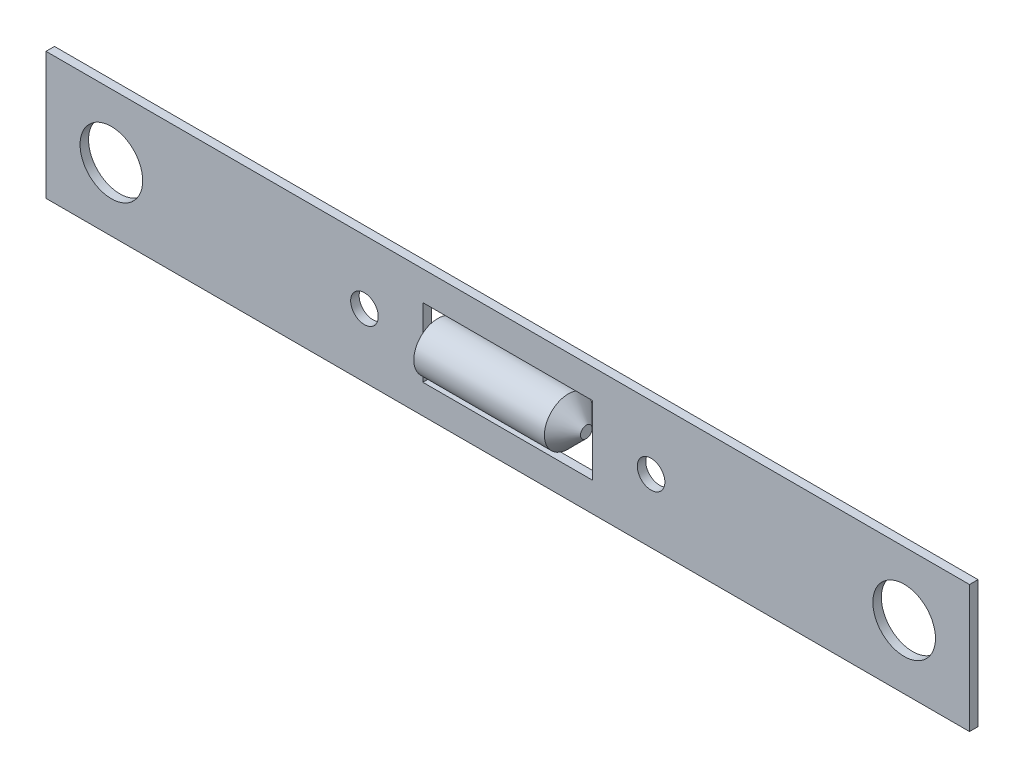
ISO-10303-21;
HEADER;
FILE_DESCRIPTION(('STEP AP214'),'2;1');
FILE_NAME('part.step','',(''),(''),'','','');
FILE_SCHEMA(('AUTOMOTIVE_DESIGN { 1 0 10303 214 1 1 1 1 }'));
ENDSEC;
DATA;
#1=APPLICATION_CONTEXT('core data for automotive mechanical design processes');
#2=APPLICATION_PROTOCOL_DEFINITION('international standard','automotive_design',2000,#1);
#3=PRODUCT_CONTEXT('',#1,'mechanical');
#4=PRODUCT('Part','Part','',(#3));
#5=PRODUCT_RELATED_PRODUCT_CATEGORY('part','',(#4));
#6=PRODUCT_DEFINITION_FORMATION('','',#4);
#7=PRODUCT_DEFINITION_CONTEXT('part definition',#1,'design');
#8=PRODUCT_DEFINITION('design','',#6,#7);
#9=PRODUCT_DEFINITION_SHAPE('','',#8);
#10=(LENGTH_UNIT() NAMED_UNIT(*) SI_UNIT(.MILLI.,.METRE.));
#11=(NAMED_UNIT(*) PLANE_ANGLE_UNIT() SI_UNIT($,.RADIAN.));
#12=(NAMED_UNIT(*) SI_UNIT($,.STERADIAN.) SOLID_ANGLE_UNIT());
#13=UNCERTAINTY_MEASURE_WITH_UNIT(LENGTH_MEASURE(1.E-05),#10,'distance_accuracy_value','');
#14=(GEOMETRIC_REPRESENTATION_CONTEXT(3) GLOBAL_UNCERTAINTY_ASSIGNED_CONTEXT((#13)) GLOBAL_UNIT_ASSIGNED_CONTEXT((#10,
#11,#12)) REPRESENTATION_CONTEXT('',''));
#15=CARTESIAN_POINT('',(0.,0.,0.));
#16=DIRECTION('',(0.,0.,1.));
#17=DIRECTION('',(1.,0.,0.));
#18=AXIS2_PLACEMENT_3D('',#15,#16,#17);
#19=CARTESIAN_POINT('',(7.,0.,0.));
#20=DIRECTION('',(1.,0.,0.));
#21=DIRECTION('',(0.,0.,-1.));
#22=AXIS2_PLACEMENT_3D('',#19,#20,#21);
#23=PLANE('',#22);
#24=CARTESIAN_POINT('',(7.00000000006185,0.,0.));
#25=DIRECTION('',(-1.,0.,0.));
#26=DIRECTION('',(0.,0.,1.));
#27=AXIS2_PLACEMENT_3D('',#24,#25,#26);
#28=CIRCLE('',#27,0.550000000032469);
#29=CARTESIAN_POINT('',(7.00000000006185,0.,0.550000000032469));
#30=VERTEX_POINT('',#29);
#31=EDGE_CURVE('P0_E18',#30,#30,#28,.T.);
#32=ORIENTED_EDGE('',*,*,#31,.F.);
#33=EDGE_LOOP('',(#32));
#34=FACE_BOUND('',#33,.T.);
#35=ADVANCED_FACE('P0_F15',(#34),#23,.T.);
#36=CARTESIAN_POINT('',(-7.,0.,0.));
#37=DIRECTION('',(1.,0.,0.));
#38=DIRECTION('',(0.,0.,-1.));
#39=AXIS2_PLACEMENT_3D('',#36,#37,#38);
#40=PLANE('',#39);
#41=CARTESIAN_POINT('',(-7.,0.,0.));
#42=DIRECTION('',(1.,0.,0.));
#43=DIRECTION('',(0.,0.,-1.));
#44=AXIS2_PLACEMENT_3D('',#41,#42,#43);
#45=CIRCLE('',#44,2.25);
#46=CARTESIAN_POINT('',(-7.,0.,-2.25));
#47=VERTEX_POINT('',#46);
#48=EDGE_CURVE('P0_E23',#47,#47,#45,.T.);
#49=ORIENTED_EDGE('',*,*,#48,.F.);
#50=EDGE_LOOP('',(#49));
#51=FACE_BOUND('',#50,.T.);
#52=ADVANCED_FACE('P0_F39',(#51),#40,.F.);
#53=CARTESIAN_POINT('',(5.30000000003383,0.,0.));
#54=DIRECTION('',(-1.,0.,0.));
#55=DIRECTION('',(0.,0.,1.));
#56=AXIS2_PLACEMENT_3D('',#53,#54,#55);
#57=CONICAL_SURFACE('',#56,2.25000000006048,0.785398163397448);
#58=CARTESIAN_POINT('',(5.3,0.,0.));
#59=DIRECTION('',(1.,0.,0.));
#60=DIRECTION('',(0.,0.,-1.));
#61=AXIS2_PLACEMENT_3D('',#58,#59,#60);
#62=CIRCLE('',#61,2.25);
#63=CARTESIAN_POINT('',(5.3,0.,2.25000000009432));
#64=VERTEX_POINT('',#63);
#65=EDGE_CURVE('P0_E10',#64,#64,#62,.F.);
#66=CARTESIAN_POINT('',(5.3,0.,2.25000000009432));
#67=CARTESIAN_POINT('',(5.31770833333398,0.,2.23229166676034));
#68=CARTESIAN_POINT('',(5.33541666666795,0.,2.21458333342636));
#69=CARTESIAN_POINT('',(5.37083333333591,0.,2.1791666667584));
#70=CARTESIAN_POINT('',(5.38854166666989,0.,2.16145833342443));
#71=CARTESIAN_POINT('',(5.42395833333784,0.,2.12604166675647));
#72=CARTESIAN_POINT('',(5.44166666667182,0.,2.10833333342249));
#73=CARTESIAN_POINT('',(5.47708333333978,0.,2.07291666675454));
#74=CARTESIAN_POINT('',(5.49479166667375,0.,2.05520833342056));
#75=CARTESIAN_POINT('',(5.53020833334171,0.,2.01979166675261));
#76=CARTESIAN_POINT('',(5.54791666667569,0.,2.00208333341863));
#77=CARTESIAN_POINT('',(5.58333333334364,0.,1.96666666675067));
#78=CARTESIAN_POINT('',(5.60104166667762,0.,1.9489583334167));
#79=CARTESIAN_POINT('',(5.63645833334557,0.,1.91354166674874));
#80=CARTESIAN_POINT('',(5.65416666667955,0.,1.89583333341476));
#81=CARTESIAN_POINT('',(5.68958333334751,0.,1.86041666674681));
#82=CARTESIAN_POINT('',(5.70729166668148,0.,1.84270833341283));
#83=CARTESIAN_POINT('',(5.74270833334944,0.,1.80729166674488));
#84=CARTESIAN_POINT('',(5.76041666668342,0.,1.7895833334109));
#85=CARTESIAN_POINT('',(5.79583333335137,0.,1.75416666674294));
#86=CARTESIAN_POINT('',(5.81354166668535,0.,1.73645833340897));
#87=CARTESIAN_POINT('',(5.8489583333533,0.,1.70104166674101));
#88=CARTESIAN_POINT('',(5.86666666668728,0.,1.68333333340703));
#89=CARTESIAN_POINT('',(5.90208333335524,0.,1.64791666673908));
#90=CARTESIAN_POINT('',(5.91979166668921,0.,1.6302083334051));
#91=CARTESIAN_POINT('',(5.95520833335717,0.,1.59479166673714));
#92=CARTESIAN_POINT('',(5.97291666669115,0.,1.57708333340317));
#93=CARTESIAN_POINT('',(6.0083333333591,0.,1.54166666673521));
#94=CARTESIAN_POINT('',(6.02604166669308,0.,1.52395833340123));
#95=CARTESIAN_POINT('',(6.06145833336103,0.,1.48854166673328));
#96=CARTESIAN_POINT('',(6.07916666669501,0.,1.4708333333993));
#97=CARTESIAN_POINT('',(6.11458333336297,0.,1.43541666673135));
#98=CARTESIAN_POINT('',(6.13229166669695,0.,1.41770833339737));
#99=CARTESIAN_POINT('',(6.1677083333649,0.,1.38229166672941));
#100=CARTESIAN_POINT('',(6.18541666669888,0.,1.36458333339544));
#101=CARTESIAN_POINT('',(6.22083333336683,0.,1.32916666672748));
#102=CARTESIAN_POINT('',(6.23854166670081,0.,1.3114583333935));
#103=CARTESIAN_POINT('',(6.27395833336876,0.,1.27604166672555));
#104=CARTESIAN_POINT('',(6.29166666670274,0.,1.25833333339157));
#105=CARTESIAN_POINT('',(6.3270833333707,0.,1.22291666672362));
#106=CARTESIAN_POINT('',(6.34479166670468,0.,1.20520833338964));
#107=CARTESIAN_POINT('',(6.38020833337263,0.,1.16979166672168));
#108=CARTESIAN_POINT('',(6.39791666670661,0.,1.15208333338771));
#109=CARTESIAN_POINT('',(6.43333333337456,0.,1.11666666671975));
#110=CARTESIAN_POINT('',(6.45104166670854,0.,1.09895833338577));
#111=CARTESIAN_POINT('',(6.4864583333765,0.,1.06354166671782));
#112=CARTESIAN_POINT('',(6.50416666671047,0.,1.04583333338384));
#113=CARTESIAN_POINT('',(6.53958333337843,0.,1.01041666671589));
#114=CARTESIAN_POINT('',(6.55729166671241,0.,0.992708333381907));
#115=CARTESIAN_POINT('',(6.59270833338036,0.,0.957291666713952));
#116=CARTESIAN_POINT('',(6.61041666671434,0.,0.939583333379975));
#117=CARTESIAN_POINT('',(6.64583333338229,0.,0.90416666671202));
#118=CARTESIAN_POINT('',(6.66354166671627,0.,0.886458333378042));
#119=CARTESIAN_POINT('',(6.69895833338423,0.,0.851041666710087));
#120=CARTESIAN_POINT('',(6.71666666671821,0.,0.83333333337611));
#121=CARTESIAN_POINT('',(6.75208333338616,0.,0.797916666708155));
#122=CARTESIAN_POINT('',(6.76979166672014,0.,0.780208333374177));
#123=CARTESIAN_POINT('',(6.80520833338809,0.,0.744791666706222));
#124=CARTESIAN_POINT('',(6.82291666672207,0.,0.727083333372244));
#125=CARTESIAN_POINT('',(6.85833333339003,0.,0.691666666704289));
#126=CARTESIAN_POINT('',(6.876041666724,0.,0.673958333370311));
#127=CARTESIAN_POINT('',(6.91145833339196,0.,0.638541666702356));
#128=CARTESIAN_POINT('',(6.92916666672594,0.,0.620833333368379));
#129=CARTESIAN_POINT('',(6.96458333339389,0.,0.585416666700424));
#130=CARTESIAN_POINT('',(6.98229166672787,0.,0.567708333366447));
#131=CARTESIAN_POINT('',(7.00000000006185,0.,0.550000000032469));
#132=B_SPLINE_CURVE_WITH_KNOTS('',3,(#66,#67,#68,#69,#70,#71,#72,#73,#74,#75,#76,#77,#78,#79,
#80,#81,#82,#83,#84,#85,#86,#87,#88,#89,#90,#91,#92,#93,#94,#95,#96,#97,#98,#99,#100,#101,#102,
#103,#104,#105,#106,#107,#108,#109,#110,#111,#112,#113,#114,#115,#116,#117,#118,#119,#120,#121,
#122,#123,#124,#125,#126,#127,#128,#129,#130,#131),.UNSPECIFIED.,.F.,.F.,(4,2,2,2,2,2,2,2,2,2,2,
2,2,2,2,2,2,2,2,2,2,2,2,2,2,2,2,2,2,2,2,2,4),(0.,0.0751300955038039,0.150260191007607,
0.225390286511412,0.300520382015215,0.37565047751902,0.450780573022823,0.525910668526628,
0.601040764030431,0.676170859534236,0.751300955038039,0.826431050541843,0.901561146045647,
0.976691241549451,1.05182133705325,1.12695143255706,1.20208152806086,1.27721162356467,
1.35234171906847,1.42747181457227,1.50260191007608,1.57773200557988,1.65286210108369,
1.72799219658749,1.80312229209129,1.8782523875951,1.9533824830989,2.02851257860271,
2.10364267410651,2.17877276961031,2.25390286511412,2.32903296061792,2.40416305612173),.UNSPECIFIED.);
#133=EDGE_CURVE('P0_BSEAM36',#64,#30,#132,.T.);
#134=ORIENTED_EDGE('',*,*,#65,.F.);
#135=ORIENTED_EDGE('',*,*,#31,.T.);
#136=ORIENTED_EDGE('',*,*,#133,.T.);
#137=ORIENTED_EDGE('',*,*,#133,.F.);
#138=EDGE_LOOP('',(#134,#136,#135,#137));
#139=FACE_BOUND('',#138,.T.);
#140=ADVANCED_FACE('P0_F36',(#139),#57,.T.);
#141=CARTESIAN_POINT('',(-7.,0.,0.));
#142=DIRECTION('',(1.,0.,0.));
#143=DIRECTION('',(0.,0.,-1.));
#144=AXIS2_PLACEMENT_3D('',#141,#142,#143);
#145=CYLINDRICAL_SURFACE('',#144,2.25);
#146=ORIENTED_EDGE('',*,*,#48,.T.);
#147=EDGE_LOOP('',(#146));
#148=FACE_BOUND('',#147,.T.);
#149=ORIENTED_EDGE('',*,*,#65,.T.);
#150=EDGE_LOOP('',(#149));
#151=FACE_BOUND('',#150,.T.);
#152=ADVANCED_FACE('P0_F45',(#148,#151),#145,.T.);
#153=CLOSED_SHELL('',(#35,#52,#140,#152));
#154=MANIFOLD_SOLID_BREP('P0_B1',#153);
#155=CARTESIAN_POINT('',(0.,0.,0.4));
#156=DIRECTION('',(0.,0.,1.));
#157=DIRECTION('',(1.,0.,0.));
#158=AXIS2_PLACEMENT_3D('',#155,#156,#157);
#159=PLANE('',#158);
#160=CARTESIAN_POINT('',(37.3430081613,0.,0.400000000000001));
#161=DIRECTION('',(0.,0.,1.));
#162=DIRECTION('',(1.,0.,0.));
#163=AXIS2_PLACEMENT_3D('',#160,#161,#162);
#164=CIRCLE('',#163,2.95);
#165=CARTESIAN_POINT('',(40.2930081613,0.,0.400000000000001));
#166=VERTEX_POINT('',#165);
#167=EDGE_CURVE('P1_E136',#166,#166,#164,.F.);
#168=ORIENTED_EDGE('',*,*,#167,.T.);
#169=EDGE_LOOP('',(#168));
#170=FACE_BOUND('',#169,.T.);
#171=CARTESIAN_POINT('',(-37.34239737607,0.,0.400000000000001));
#172=DIRECTION('',(0.,0.,1.));
#173=DIRECTION('',(1.,0.,0.));
#174=AXIS2_PLACEMENT_3D('',#171,#172,#173);
#175=CIRCLE('',#174,2.95);
#176=CARTESIAN_POINT('',(-34.39239737607,0.,0.400000000000001));
#177=VERTEX_POINT('',#176);
#178=EDGE_CURVE('P1_E140',#177,#177,#175,.F.);
#179=ORIENTED_EDGE('',*,*,#178,.T.);
#180=EDGE_LOOP('',(#179));
#181=FACE_BOUND('',#180,.T.);
#182=CARTESIAN_POINT('',(13.5,0.,0.4));
#183=DIRECTION('',(0.,0.,1.));
#184=DIRECTION('',(1.,0.,0.));
#185=AXIS2_PLACEMENT_3D('',#182,#183,#184);
#186=CIRCLE('',#185,1.3);
#187=CARTESIAN_POINT('',(14.8,0.,0.4));
#188=VERTEX_POINT('',#187);
#189=EDGE_CURVE('P1_E142',#188,#188,#186,.F.);
#190=ORIENTED_EDGE('',*,*,#189,.T.);
#191=EDGE_LOOP('',(#190));
#192=FACE_BOUND('',#191,.T.);
#193=CARTESIAN_POINT('',(-13.5,0.,0.4));
#194=DIRECTION('',(0.,0.,1.));
#195=DIRECTION('',(1.,0.,0.));
#196=AXIS2_PLACEMENT_3D('',#193,#194,#195);
#197=CIRCLE('',#196,1.3);
#198=CARTESIAN_POINT('',(-12.2,0.,0.4));
#199=VERTEX_POINT('',#198);
#200=EDGE_CURVE('P1_E20',#199,#199,#197,.F.);
#201=ORIENTED_EDGE('',*,*,#200,.T.);
#202=EDGE_LOOP('',(#201));
#203=FACE_BOUND('',#202,.T.);
#204=DIRECTION('',(1.,0.,0.));
#205=VECTOR('',#204,1.);
#206=CARTESIAN_POINT('',(-8.,-3.25,0.4));
#207=LINE('',#206,#205);
#208=CARTESIAN_POINT('',(8.,-3.25,0.4));
#209=VERTEX_POINT('',#208);
#210=CARTESIAN_POINT('',(-8.,-3.25,0.4));
#211=VERTEX_POINT('',#210);
#212=EDGE_CURVE('P1_E157',#209,#211,#207,.F.);
#213=ORIENTED_EDGE('',*,*,#212,.T.);
#214=DIRECTION('',(0.,1.,0.));
#215=VECTOR('',#214,1.);
#216=CARTESIAN_POINT('',(-8.,3.25,0.4));
#217=LINE('',#216,#215);
#218=CARTESIAN_POINT('',(-8.,3.25,0.4));
#219=VERTEX_POINT('',#218);
#220=EDGE_CURVE('P1_E186',#211,#219,#217,.T.);
#221=ORIENTED_EDGE('',*,*,#220,.T.);
#222=DIRECTION('',(1.,0.,0.));
#223=VECTOR('',#222,1.);
#224=CARTESIAN_POINT('',(8.,3.25,0.4));
#225=LINE('',#224,#223);
#226=CARTESIAN_POINT('',(8.,3.25,0.4));
#227=VERTEX_POINT('',#226);
#228=EDGE_CURVE('P1_E179',#219,#227,#225,.T.);
#229=ORIENTED_EDGE('',*,*,#228,.T.);
#230=DIRECTION('',(0.,1.,0.));
#231=VECTOR('',#230,1.);
#232=CARTESIAN_POINT('',(8.,-3.25,0.4));
#233=LINE('',#232,#231);
#234=EDGE_CURVE('P1_E172',#227,#209,#233,.F.);
#235=ORIENTED_EDGE('',*,*,#234,.T.);
#236=EDGE_LOOP('',(#213,#221,#229,#235));
#237=FACE_BOUND('',#236,.T.);
#238=DIRECTION('',(1.,0.,0.));
#239=VECTOR('',#238,1.);
#240=CARTESIAN_POINT('',(41.,6.,0.4));
#241=LINE('',#240,#239);
#242=CARTESIAN_POINT('',(-43.5,6.,0.4));
#243=VERTEX_POINT('',#242);
#244=CARTESIAN_POINT('',(43.5,6.,0.4));
#245=VERTEX_POINT('',#244);
#246=EDGE_CURVE('P1_E112',#243,#245,#241,.T.);
#247=ORIENTED_EDGE('',*,*,#246,.F.);
#248=DIRECTION('',(0.,1.,0.));
#249=VECTOR('',#248,1.);
#250=CARTESIAN_POINT('',(-43.5,6.,0.4));
#251=LINE('',#250,#249);
#252=CARTESIAN_POINT('',(-43.5,-6.,0.4));
#253=VERTEX_POINT('',#252);
#254=EDGE_CURVE('P1_E109',#253,#243,#251,.T.);
#255=ORIENTED_EDGE('',*,*,#254,.F.);
#256=DIRECTION('',(1.,0.,0.));
#257=VECTOR('',#256,1.);
#258=CARTESIAN_POINT('',(-41.,-6.,0.4));
#259=LINE('',#258,#257);
#260=CARTESIAN_POINT('',(43.5,-6.,0.4));
#261=VERTEX_POINT('',#260);
#262=EDGE_CURVE('P1_E99',#261,#253,#259,.F.);
#263=ORIENTED_EDGE('',*,*,#262,.F.);
#264=DIRECTION('',(0.,1.,0.));
#265=VECTOR('',#264,1.);
#266=CARTESIAN_POINT('',(43.5,-6.,0.4));
#267=LINE('',#266,#265);
#268=EDGE_CURVE('P1_E94',#245,#261,#267,.F.);
#269=ORIENTED_EDGE('',*,*,#268,.F.);
#270=EDGE_LOOP('',(#247,#255,#263,#269));
#271=FACE_BOUND('',#270,.T.);
#272=ADVANCED_FACE('P1_F17',(#170,#181,#192,#203,#237,#271),#159,.T.);
#273=CARTESIAN_POINT('',(-43.5,6.,-0.4));
#274=DIRECTION('',(-1.,0.,0.));
#275=DIRECTION('',(0.,0.,1.));
#276=AXIS2_PLACEMENT_3D('',#273,#274,#275);
#277=PLANE('',#276);
#278=DIRECTION('',(0.,0.,1.));
#279=VECTOR('',#278,1.);
#280=CARTESIAN_POINT('',(-43.5,6.,-0.4));
#281=LINE('',#280,#279);
#282=CARTESIAN_POINT('',(-43.5,6.,-0.4));
#283=VERTEX_POINT('',#282);
#284=EDGE_CURVE('P1_E192',#283,#243,#281,.T.);
#285=ORIENTED_EDGE('',*,*,#284,.F.);
#286=DIRECTION('',(0.,1.,0.));
#287=VECTOR('',#286,1.);
#288=CARTESIAN_POINT('',(-43.5,0.,-0.4));
#289=LINE('',#288,#287);
#290=CARTESIAN_POINT('',(-43.5,-6.,-0.4));
#291=VERTEX_POINT('',#290);
#292=EDGE_CURVE('P1_E119',#283,#291,#289,.F.);
#293=ORIENTED_EDGE('',*,*,#292,.T.);
#294=DIRECTION('',(0.,0.,-1.));
#295=VECTOR('',#294,1.);
#296=CARTESIAN_POINT('',(-43.5,-6.,-0.4));
#297=LINE('',#296,#295);
#298=EDGE_CURVE('P1_E104',#253,#291,#297,.T.);
#299=ORIENTED_EDGE('',*,*,#298,.F.);
#300=ORIENTED_EDGE('',*,*,#254,.T.);
#301=EDGE_LOOP('',(#285,#293,#299,#300));
#302=FACE_BOUND('',#301,.T.);
#303=ADVANCED_FACE('P1_F118',(#302),#277,.T.);
#304=CARTESIAN_POINT('',(-41.,-6.,-0.4));
#305=DIRECTION('',(0.,-1.,0.));
#306=DIRECTION('',(0.,0.,-1.));
#307=AXIS2_PLACEMENT_3D('',#304,#305,#306);
#308=PLANE('',#307);
#309=ORIENTED_EDGE('',*,*,#298,.T.);
#310=DIRECTION('',(1.,0.,0.));
#311=VECTOR('',#310,1.);
#312=CARTESIAN_POINT('',(0.,-6.,-0.4));
#313=LINE('',#312,#311);
#314=CARTESIAN_POINT('',(43.5,-6.,-0.4));
#315=VERTEX_POINT('',#314);
#316=EDGE_CURVE('P1_E201',#291,#315,#313,.T.);
#317=ORIENTED_EDGE('',*,*,#316,.T.);
#318=DIRECTION('',(0.,0.,-1.));
#319=VECTOR('',#318,1.);
#320=CARTESIAN_POINT('',(43.5,-6.,-0.4));
#321=LINE('',#320,#319);
#322=EDGE_CURVE('P1_E106',#261,#315,#321,.T.);
#323=ORIENTED_EDGE('',*,*,#322,.F.);
#324=ORIENTED_EDGE('',*,*,#262,.T.);
#325=EDGE_LOOP('',(#309,#317,#323,#324));
#326=FACE_BOUND('',#325,.T.);
#327=ADVANCED_FACE('P1_F101',(#326),#308,.T.);
#328=CARTESIAN_POINT('',(43.5,-6.,-0.4));
#329=DIRECTION('',(1.,0.,0.));
#330=DIRECTION('',(0.,0.,-1.));
#331=AXIS2_PLACEMENT_3D('',#328,#329,#330);
#332=PLANE('',#331);
#333=ORIENTED_EDGE('',*,*,#322,.T.);
#334=DIRECTION('',(0.,1.,0.));
#335=VECTOR('',#334,1.);
#336=CARTESIAN_POINT('',(43.5,0.,-0.4));
#337=LINE('',#336,#335);
#338=CARTESIAN_POINT('',(43.5,6.,-0.4));
#339=VERTEX_POINT('',#338);
#340=EDGE_CURVE('P1_E197',#315,#339,#337,.T.);
#341=ORIENTED_EDGE('',*,*,#340,.T.);
#342=DIRECTION('',(0.,0.,1.));
#343=VECTOR('',#342,1.);
#344=CARTESIAN_POINT('',(43.5,6.,-0.4));
#345=LINE('',#344,#343);
#346=EDGE_CURVE('P1_E188',#245,#339,#345,.F.);
#347=ORIENTED_EDGE('',*,*,#346,.F.);
#348=ORIENTED_EDGE('',*,*,#268,.T.);
#349=EDGE_LOOP('',(#333,#341,#347,#348));
#350=FACE_BOUND('',#349,.T.);
#351=ADVANCED_FACE('P1_F196',(#350),#332,.T.);
#352=CARTESIAN_POINT('',(41.,6.,-0.4));
#353=DIRECTION('',(0.,1.,0.));
#354=DIRECTION('',(0.,0.,1.));
#355=AXIS2_PLACEMENT_3D('',#352,#353,#354);
#356=PLANE('',#355);
#357=ORIENTED_EDGE('',*,*,#346,.T.);
#358=DIRECTION('',(1.,0.,0.));
#359=VECTOR('',#358,1.);
#360=CARTESIAN_POINT('',(0.,6.,-0.4));
#361=LINE('',#360,#359);
#362=EDGE_CURVE('P1_E203',#339,#283,#361,.F.);
#363=ORIENTED_EDGE('',*,*,#362,.T.);
#364=ORIENTED_EDGE('',*,*,#284,.T.);
#365=ORIENTED_EDGE('',*,*,#246,.T.);
#366=EDGE_LOOP('',(#357,#363,#364,#365));
#367=FACE_BOUND('',#366,.T.);
#368=ADVANCED_FACE('P1_F271',(#367),#356,.T.);
#369=CARTESIAN_POINT('',(-8.,3.25,-5.25));
#370=DIRECTION('',(-1.,0.,0.));
#371=DIRECTION('',(0.,0.,1.));
#372=AXIS2_PLACEMENT_3D('',#369,#370,#371);
#373=PLANE('',#372);
#374=ORIENTED_EDGE('',*,*,#220,.F.);
#375=DIRECTION('',(0.,0.,-1.));
#376=VECTOR('',#375,1.);
#377=CARTESIAN_POINT('',(-8.,-3.25,-5.25));
#378=LINE('',#377,#376);
#379=CARTESIAN_POINT('',(-8.,-3.25,-0.4));
#380=VERTEX_POINT('',#379);
#381=EDGE_CURVE('P1_E151',#211,#380,#378,.T.);
#382=ORIENTED_EDGE('',*,*,#381,.T.);
#383=DIRECTION('',(0.,1.,0.));
#384=VECTOR('',#383,1.);
#385=CARTESIAN_POINT('',(-8.,0.,-0.4));
#386=LINE('',#385,#384);
#387=CARTESIAN_POINT('',(-8.,3.25,-0.4));
#388=VERTEX_POINT('',#387);
#389=EDGE_CURVE('P1_E209',#380,#388,#386,.T.);
#390=ORIENTED_EDGE('',*,*,#389,.T.);
#391=DIRECTION('',(0.,0.,1.));
#392=VECTOR('',#391,1.);
#393=CARTESIAN_POINT('',(-8.,3.25,-5.25));
#394=LINE('',#393,#392);
#395=EDGE_CURVE('P1_E182',#388,#219,#394,.T.);
#396=ORIENTED_EDGE('',*,*,#395,.T.);
#397=EDGE_LOOP('',(#374,#382,#390,#396));
#398=FACE_BOUND('',#397,.T.);
#399=ADVANCED_FACE('P1_F230',(#398),#373,.F.);
#400=CARTESIAN_POINT('',(8.,3.25,-5.25));
#401=DIRECTION('',(0.,1.,0.));
#402=DIRECTION('',(0.,0.,1.));
#403=AXIS2_PLACEMENT_3D('',#400,#401,#402);
#404=PLANE('',#403);
#405=ORIENTED_EDGE('',*,*,#228,.F.);
#406=ORIENTED_EDGE('',*,*,#395,.F.);
#407=DIRECTION('',(1.,0.,0.));
#408=VECTOR('',#407,1.);
#409=CARTESIAN_POINT('',(0.,3.25,-0.4));
#410=LINE('',#409,#408);
#411=CARTESIAN_POINT('',(8.,3.25,-0.4));
#412=VERTEX_POINT('',#411);
#413=EDGE_CURVE('P1_E211',#388,#412,#410,.T.);
#414=ORIENTED_EDGE('',*,*,#413,.T.);
#415=DIRECTION('',(0.,0.,-1.));
#416=VECTOR('',#415,1.);
#417=CARTESIAN_POINT('',(8.,3.25,-5.25));
#418=LINE('',#417,#416);
#419=EDGE_CURVE('P1_E175',#412,#227,#418,.F.);
#420=ORIENTED_EDGE('',*,*,#419,.T.);
#421=EDGE_LOOP('',(#405,#406,#414,#420));
#422=FACE_BOUND('',#421,.T.);
#423=ADVANCED_FACE('P1_F229',(#422),#404,.F.);
#424=CARTESIAN_POINT('',(8.,-3.25,-5.25));
#425=DIRECTION('',(1.,0.,0.));
#426=DIRECTION('',(0.,0.,-1.));
#427=AXIS2_PLACEMENT_3D('',#424,#425,#426);
#428=PLANE('',#427);
#429=ORIENTED_EDGE('',*,*,#234,.F.);
#430=ORIENTED_EDGE('',*,*,#419,.F.);
#431=DIRECTION('',(0.,1.,0.));
#432=VECTOR('',#431,1.);
#433=CARTESIAN_POINT('',(8.,0.,-0.4));
#434=LINE('',#433,#432);
#435=CARTESIAN_POINT('',(8.,-3.25,-0.4));
#436=VERTEX_POINT('',#435);
#437=EDGE_CURVE('P1_E215',#412,#436,#434,.F.);
#438=ORIENTED_EDGE('',*,*,#437,.T.);
#439=DIRECTION('',(0.,0.,-1.));
#440=VECTOR('',#439,1.);
#441=CARTESIAN_POINT('',(8.,-3.25,-5.25));
#442=LINE('',#441,#440);
#443=EDGE_CURVE('P1_E40',#436,#209,#442,.F.);
#444=ORIENTED_EDGE('',*,*,#443,.T.);
#445=EDGE_LOOP('',(#429,#430,#438,#444));
#446=FACE_BOUND('',#445,.T.);
#447=ADVANCED_FACE('P1_F226',(#446),#428,.F.);
#448=CARTESIAN_POINT('',(-8.,-3.25,-5.25));
#449=DIRECTION('',(0.,-1.,0.));
#450=DIRECTION('',(0.,0.,-1.));
#451=AXIS2_PLACEMENT_3D('',#448,#449,#450);
#452=PLANE('',#451);
#453=ORIENTED_EDGE('',*,*,#212,.F.);
#454=ORIENTED_EDGE('',*,*,#443,.F.);
#455=DIRECTION('',(1.,0.,0.));
#456=VECTOR('',#455,1.);
#457=CARTESIAN_POINT('',(0.,-3.25,-0.4));
#458=LINE('',#457,#456);
#459=EDGE_CURVE('P1_E135',#436,#380,#458,.F.);
#460=ORIENTED_EDGE('',*,*,#459,.T.);
#461=ORIENTED_EDGE('',*,*,#381,.F.);
#462=EDGE_LOOP('',(#453,#454,#460,#461));
#463=FACE_BOUND('',#462,.T.);
#464=ADVANCED_FACE('P1_F220',(#463),#452,.F.);
#465=CARTESIAN_POINT('',(-13.5,0.,0.4));
#466=DIRECTION('',(0.,0.,1.));
#467=DIRECTION('',(1.,0.,0.));
#468=AXIS2_PLACEMENT_3D('',#465,#466,#467);
#469=CYLINDRICAL_SURFACE('',#468,1.3);
#470=ORIENTED_EDGE('',*,*,#200,.F.);
#471=EDGE_LOOP('',(#470));
#472=FACE_BOUND('',#471,.T.);
#473=CARTESIAN_POINT('',(-13.5,0.,-0.4));
#474=DIRECTION('',(0.,0.,1.));
#475=DIRECTION('',(1.,0.,0.));
#476=AXIS2_PLACEMENT_3D('',#473,#474,#475);
#477=CIRCLE('',#476,1.3);
#478=CARTESIAN_POINT('',(-12.2,0.,-0.4));
#479=VERTEX_POINT('',#478);
#480=EDGE_CURVE('P1_E131',#479,#479,#477,.F.);
#481=ORIENTED_EDGE('',*,*,#480,.T.);
#482=EDGE_LOOP('',(#481));
#483=FACE_BOUND('',#482,.T.);
#484=ADVANCED_FACE('P1_F258',(#472,#483),#469,.F.);
#485=CARTESIAN_POINT('',(13.5,0.,0.4));
#486=DIRECTION('',(0.,0.,1.));
#487=DIRECTION('',(1.,0.,0.));
#488=AXIS2_PLACEMENT_3D('',#485,#486,#487);
#489=CYLINDRICAL_SURFACE('',#488,1.3);
#490=ORIENTED_EDGE('',*,*,#189,.F.);
#491=EDGE_LOOP('',(#490));
#492=FACE_BOUND('',#491,.T.);
#493=CARTESIAN_POINT('',(13.5,0.,-0.4));
#494=DIRECTION('',(0.,0.,1.));
#495=DIRECTION('',(1.,0.,0.));
#496=AXIS2_PLACEMENT_3D('',#493,#494,#495);
#497=CIRCLE('',#496,1.3);
#498=CARTESIAN_POINT('',(14.8,0.,-0.4));
#499=VERTEX_POINT('',#498);
#500=EDGE_CURVE('P1_E127',#499,#499,#497,.F.);
#501=ORIENTED_EDGE('',*,*,#500,.T.);
#502=EDGE_LOOP('',(#501));
#503=FACE_BOUND('',#502,.T.);
#504=ADVANCED_FACE('P1_F254',(#492,#503),#489,.F.);
#505=CARTESIAN_POINT('',(-37.34239737607,0.,-21.2));
#506=DIRECTION('',(0.,0.,1.));
#507=DIRECTION('',(1.,0.,0.));
#508=AXIS2_PLACEMENT_3D('',#505,#506,#507);
#509=CYLINDRICAL_SURFACE('',#508,2.95);
#510=ORIENTED_EDGE('',*,*,#178,.F.);
#511=EDGE_LOOP('',(#510));
#512=FACE_BOUND('',#511,.T.);
#513=CARTESIAN_POINT('',(-37.34239737607,0.,-0.400000000000001));
#514=DIRECTION('',(0.,0.,1.));
#515=DIRECTION('',(1.,0.,0.));
#516=AXIS2_PLACEMENT_3D('',#513,#514,#515);
#517=CIRCLE('',#516,2.95);
#518=CARTESIAN_POINT('',(-34.39239737607,0.,-0.400000000000001));
#519=VERTEX_POINT('',#518);
#520=EDGE_CURVE('P1_E27',#519,#519,#517,.F.);
#521=ORIENTED_EDGE('',*,*,#520,.T.);
#522=EDGE_LOOP('',(#521));
#523=FACE_BOUND('',#522,.T.);
#524=ADVANCED_FACE('P1_F246',(#512,#523),#509,.F.);
#525=CARTESIAN_POINT('',(37.3430081613,0.,-21.2));
#526=DIRECTION('',(0.,0.,1.));
#527=DIRECTION('',(1.,0.,0.));
#528=AXIS2_PLACEMENT_3D('',#525,#526,#527);
#529=CYLINDRICAL_SURFACE('',#528,2.95);
#530=ORIENTED_EDGE('',*,*,#167,.F.);
#531=EDGE_LOOP('',(#530));
#532=FACE_BOUND('',#531,.T.);
#533=CARTESIAN_POINT('',(37.3430081613,0.,-0.400000000000001));
#534=DIRECTION('',(0.,0.,1.));
#535=DIRECTION('',(1.,0.,0.));
#536=AXIS2_PLACEMENT_3D('',#533,#534,#535);
#537=CIRCLE('',#536,2.95);
#538=CARTESIAN_POINT('',(40.2930081613,0.,-0.400000000000001));
#539=VERTEX_POINT('',#538);
#540=EDGE_CURVE('P1_E11',#539,#539,#537,.F.);
#541=ORIENTED_EDGE('',*,*,#540,.T.);
#542=EDGE_LOOP('',(#541));
#543=FACE_BOUND('',#542,.T.);
#544=ADVANCED_FACE('P1_F240',(#532,#543),#529,.F.);
#545=CARTESIAN_POINT('',(0.,0.,-0.4));
#546=DIRECTION('',(0.,0.,1.));
#547=DIRECTION('',(1.,0.,0.));
#548=AXIS2_PLACEMENT_3D('',#545,#546,#547);
#549=PLANE('',#548);
#550=ORIENTED_EDGE('',*,*,#540,.F.);
#551=EDGE_LOOP('',(#550));
#552=FACE_BOUND('',#551,.T.);
#553=ORIENTED_EDGE('',*,*,#520,.F.);
#554=EDGE_LOOP('',(#553));
#555=FACE_BOUND('',#554,.T.);
#556=ORIENTED_EDGE('',*,*,#500,.F.);
#557=EDGE_LOOP('',(#556));
#558=FACE_BOUND('',#557,.T.);
#559=ORIENTED_EDGE('',*,*,#480,.F.);
#560=EDGE_LOOP('',(#559));
#561=FACE_BOUND('',#560,.T.);
#562=ORIENTED_EDGE('',*,*,#437,.F.);
#563=ORIENTED_EDGE('',*,*,#413,.F.);
#564=ORIENTED_EDGE('',*,*,#389,.F.);
#565=ORIENTED_EDGE('',*,*,#459,.F.);
#566=EDGE_LOOP('',(#562,#563,#564,#565));
#567=FACE_BOUND('',#566,.T.);
#568=ORIENTED_EDGE('',*,*,#340,.F.);
#569=ORIENTED_EDGE('',*,*,#316,.F.);
#570=ORIENTED_EDGE('',*,*,#292,.F.);
#571=ORIENTED_EDGE('',*,*,#362,.F.);
#572=EDGE_LOOP('',(#568,#569,#570,#571));
#573=FACE_BOUND('',#572,.T.);
#574=ADVANCED_FACE('P1_F200',(#552,#555,#558,#561,#567,#573),#549,.F.);
#575=CLOSED_SHELL('',(#272,#303,#327,#351,#368,#399,#423,#447,#464,#484,#504,#524,#544,#574));
#576=MANIFOLD_SOLID_BREP('P1_B1',#575);
#577=ADVANCED_BREP_SHAPE_REPRESENTATION('',(#18,#154,#576),#14);
#578=SHAPE_DEFINITION_REPRESENTATION(#9,#577);
ENDSEC;
END-ISO-10303-21;
